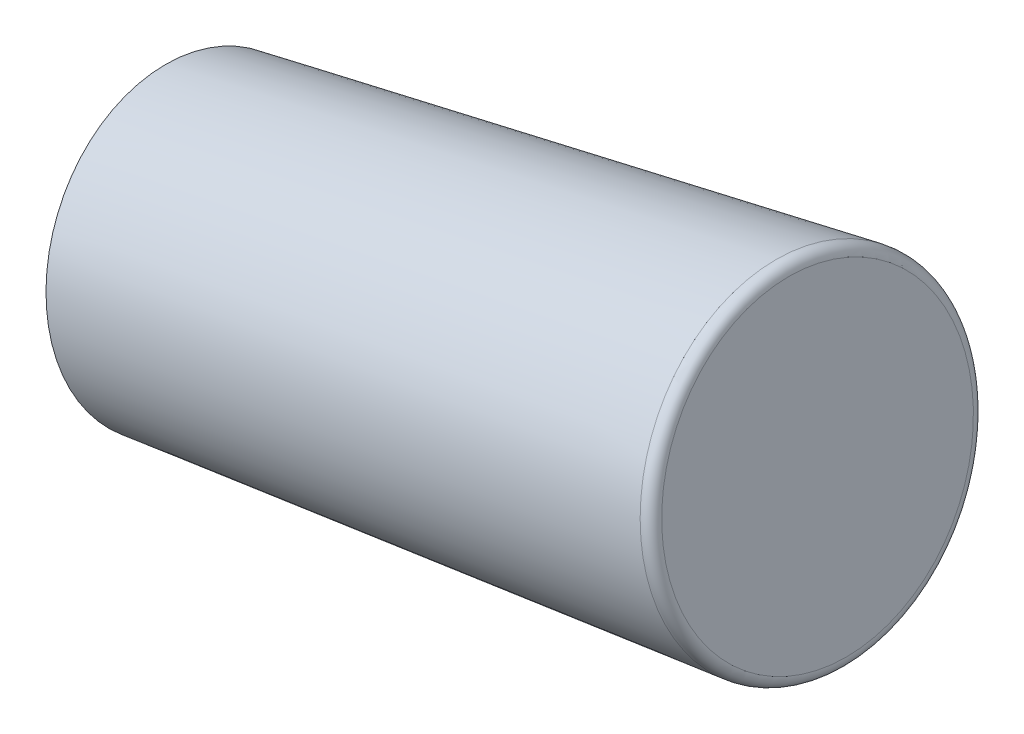
ISO-10303-21;
HEADER;
FILE_DESCRIPTION(('STEP AP214'),'2;1');
FILE_NAME('part.step','',(''),(''),'','','');
FILE_SCHEMA(('AUTOMOTIVE_DESIGN { 1 0 10303 214 1 1 1 1 }'));
ENDSEC;
DATA;
#1=APPLICATION_CONTEXT('core data for automotive mechanical design processes');
#2=APPLICATION_PROTOCOL_DEFINITION('international standard','automotive_design',2000,#1);
#3=PRODUCT_CONTEXT('',#1,'mechanical');
#4=PRODUCT('Part','Part','',(#3));
#5=PRODUCT_RELATED_PRODUCT_CATEGORY('part','',(#4));
#6=PRODUCT_DEFINITION_FORMATION('','',#4);
#7=PRODUCT_DEFINITION_CONTEXT('part definition',#1,'design');
#8=PRODUCT_DEFINITION('design','',#6,#7);
#9=PRODUCT_DEFINITION_SHAPE('','',#8);
#10=(LENGTH_UNIT() NAMED_UNIT(*) SI_UNIT(.MILLI.,.METRE.));
#11=(NAMED_UNIT(*) PLANE_ANGLE_UNIT() SI_UNIT($,.RADIAN.));
#12=(NAMED_UNIT(*) SI_UNIT($,.STERADIAN.) SOLID_ANGLE_UNIT());
#13=UNCERTAINTY_MEASURE_WITH_UNIT(LENGTH_MEASURE(1.E-05),#10,'distance_accuracy_value','');
#14=(GEOMETRIC_REPRESENTATION_CONTEXT(3) GLOBAL_UNCERTAINTY_ASSIGNED_CONTEXT((#13)) GLOBAL_UNIT_ASSIGNED_CONTEXT((#10,
#11,#12)) REPRESENTATION_CONTEXT('',''));
#15=CARTESIAN_POINT('',(0.,0.,0.));
#16=DIRECTION('',(0.,0.,1.));
#17=DIRECTION('',(1.,0.,0.));
#18=AXIS2_PLACEMENT_3D('',#15,#16,#17);
#19=CARTESIAN_POINT('',(19.2097741059784,33.1401432762153,-3.33066907387547E-13));
#20=DIRECTION('',(0.982336419776743,0.187123377428451,0.));
#21=DIRECTION('',(-0.187123377428449,0.982336419776748,0.));
#22=AXIS2_PLACEMENT_3D('',#19,#20,#21);
#23=CONICAL_SURFACE('',#22,4.33327468896911,1.57074958818923);
#24=CARTESIAN_POINT('',(19.2095751521842,33.140105377885,-2.22044604925031E-12));
#25=VERTEX_POINT('',#24);
#26=VERTEX_LOOP('',#25);
#27=FACE_BOUND('',#26,.T.);
#28=CARTESIAN_POINT('',(19.2097741054734,33.1401432761176,-7.7715611723761E-13));
#29=DIRECTION('',(-0.982336419776743,-0.187123377428449,0.));
#30=DIRECTION('',(0.187123377428449,-0.982336419776749,0.));
#31=AXIS2_PLACEMENT_3D('',#28,#29,#30);
#32=CIRCLE('',#31,4.33327432481955);
#33=CARTESIAN_POINT('',(20.0206310324576,28.8834100899638,-7.75472301913008E-13));
#34=VERTEX_POINT('',#33);
#35=EDGE_CURVE('E32',#34,#34,#32,.T.);
#36=ORIENTED_EDGE('',*,*,#35,.F.);
#37=EDGE_LOOP('',(#36));
#38=FACE_BOUND('',#37,.T.);
#39=ADVANCED_FACE('F17',(#27,#38),#23,.F.);
#40=CARTESIAN_POINT('',(1.53599999999499,29.7734999999997,-1.33226762955019E-12));
#41=DIRECTION('',(0.982336419776743,0.187123377428449,0.));
#42=DIRECTION('',(-0.187123377428449,0.982336419776749,0.));
#43=AXIS2_PLACEMENT_3D('',#40,#41,#42);
#44=PLANE('',#43);
#45=CARTESIAN_POINT('',(1.53599999998677,29.7735000000001,1.33226762955019E-12));
#46=DIRECTION('',(0.982336419776742,0.187123377428451,0.));
#47=DIRECTION('',(-0.187123377428451,0.982336419776747,0.));
#48=AXIS2_PLACEMENT_3D('',#45,#46,#47);
#49=CIRCLE('',#48,4.07752366640557);
#50=CARTESIAN_POINT('',(0.77299999998452,33.7790000000119,1.3361155461094E-12));
#51=VERTEX_POINT('',#50);
#52=EDGE_CURVE('E20',#51,#51,#49,.T.);
#53=ORIENTED_EDGE('',*,*,#52,.F.);
#54=EDGE_LOOP('',(#53));
#55=FACE_BOUND('',#54,.T.);
#56=ADVANCED_FACE('F29',(#55),#44,.F.);
#57=CARTESIAN_POINT('',(18.915073179863,33.0840062629477,7.7715611723761E-13));
#58=DIRECTION('',(-0.982336419776743,-0.187123377428449,0.));
#59=DIRECTION('',(0.187123377428448,-0.982336419776733,-1.28103986611846E-13));
#60=AXIS2_PLACEMENT_3D('',#57,#58,#59);
#61=TOROIDAL_SURFACE('',#60,4.33328834640064,0.300000000000119);
#62=CARTESIAN_POINT('',(18.9058175182294,33.082243169746,-6.66133814775094E-13));
#63=DIRECTION('',(0.982336419776743,0.187123377428449,0.));
#64=DIRECTION('',(-0.187123377428448,0.982336419776747,0.));
#65=AXIS2_PLACEMENT_3D('',#62,#63,#64);
#66=CIRCLE('',#65,4.63314035027437);
#67=CARTESIAN_POINT('',(18.038848647786,37.6335456737577,-6.61761568545879E-13));
#68=VERTEX_POINT('',#67);
#69=EDGE_CURVE('E11',#68,#68,#66,.F.);
#70=ORIENTED_EDGE('',*,*,#69,.F.);
#71=EDGE_LOOP('',(#70));
#72=FACE_BOUND('',#71,.T.);
#73=ORIENTED_EDGE('',*,*,#35,.T.);
#74=EDGE_LOOP('',(#73));
#75=FACE_BOUND('',#74,.T.);
#76=ADVANCED_FACE('F38',(#72,#75),#61,.T.);
#77=CARTESIAN_POINT('',(18.9058175182294,33.082243169746,-6.66133814775094E-13));
#78=DIRECTION('',(0.982336419776742,0.187123377428451,0.));
#79=DIRECTION('',(-0.187123377428451,0.982336419776747,0.));
#80=AXIS2_PLACEMENT_3D('',#77,#78,#79);
#81=CONICAL_SURFACE('',#80,4.63314035027437,0.0314121304487897);
#82=ORIENTED_EDGE('',*,*,#52,.T.);
#83=EDGE_LOOP('',(#82));
#84=FACE_BOUND('',#83,.T.);
#85=ORIENTED_EDGE('',*,*,#69,.T.);
#86=EDGE_LOOP('',(#85));
#87=FACE_BOUND('',#86,.T.);
#88=ADVANCED_FACE('F41',(#84,#87),#81,.T.);
#89=CLOSED_SHELL('',(#39,#56,#76,#88));
#90=MANIFOLD_SOLID_BREP('B1',#89);
#91=ADVANCED_BREP_SHAPE_REPRESENTATION('',(#18,#90),#14);
#92=SHAPE_DEFINITION_REPRESENTATION(#9,#91);
ENDSEC;
END-ISO-10303-21;
